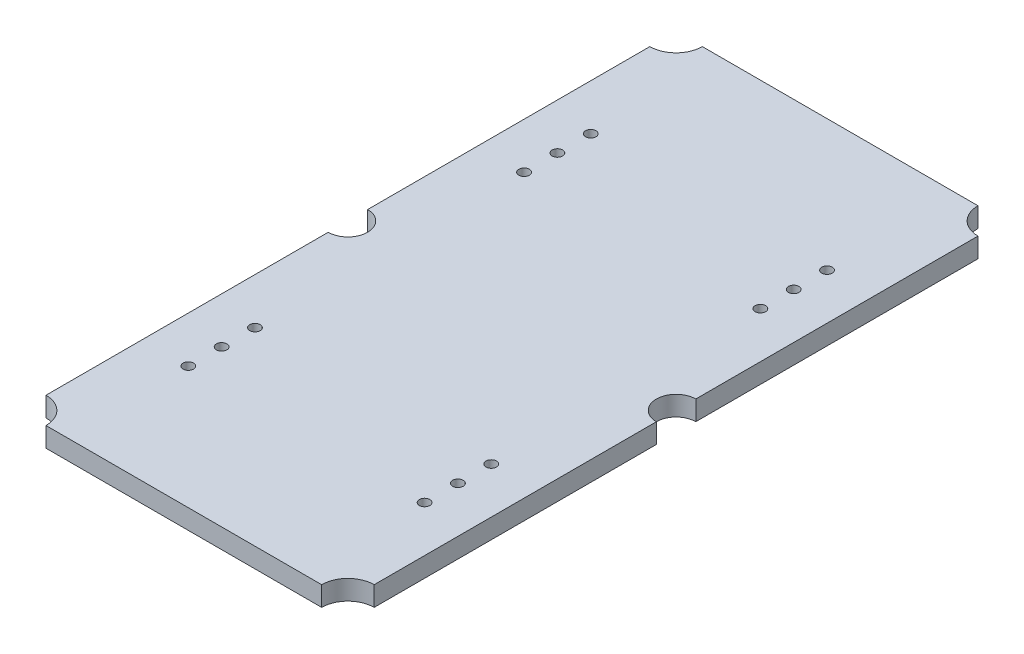
ISO-10303-21;
HEADER;
FILE_DESCRIPTION(('STEP AP214'),'2;1');
FILE_NAME('part.step','',(''),(''),'','','');
FILE_SCHEMA(('AUTOMOTIVE_DESIGN { 1 0 10303 214 1 1 1 1 }'));
ENDSEC;
DATA;
#1=APPLICATION_CONTEXT('core data for automotive mechanical design processes');
#2=APPLICATION_PROTOCOL_DEFINITION('international standard','automotive_design',2000,#1);
#3=PRODUCT_CONTEXT('',#1,'mechanical');
#4=PRODUCT('Part','Part','',(#3));
#5=PRODUCT_RELATED_PRODUCT_CATEGORY('part','',(#4));
#6=PRODUCT_DEFINITION_FORMATION('','',#4);
#7=PRODUCT_DEFINITION_CONTEXT('part definition',#1,'design');
#8=PRODUCT_DEFINITION('design','',#6,#7);
#9=PRODUCT_DEFINITION_SHAPE('','',#8);
#10=(LENGTH_UNIT() NAMED_UNIT(*) SI_UNIT(.MILLI.,.METRE.));
#11=(NAMED_UNIT(*) PLANE_ANGLE_UNIT() SI_UNIT($,.RADIAN.));
#12=(NAMED_UNIT(*) SI_UNIT($,.STERADIAN.) SOLID_ANGLE_UNIT());
#13=UNCERTAINTY_MEASURE_WITH_UNIT(LENGTH_MEASURE(1.E-05),#10,'distance_accuracy_value','');
#14=(GEOMETRIC_REPRESENTATION_CONTEXT(3) GLOBAL_UNCERTAINTY_ASSIGNED_CONTEXT((#13)) GLOBAL_UNIT_ASSIGNED_CONTEXT((#10,
#11,#12)) REPRESENTATION_CONTEXT('',''));
#15=CARTESIAN_POINT('',(0.,0.,0.));
#16=DIRECTION('',(0.,0.,1.));
#17=DIRECTION('',(1.,0.,0.));
#18=AXIS2_PLACEMENT_3D('',#15,#16,#17);
#19=CARTESIAN_POINT('',(0.,1.5,0.));
#20=DIRECTION('',(1.,0.,0.));
#21=DIRECTION('',(0.,0.,-1.));
#22=AXIS2_PLACEMENT_3D('',#19,#20,#21);
#23=PLANE('',#22);
#24=DIRECTION('',(0.,0.,1.));
#25=VECTOR('',#24,1.);
#26=CARTESIAN_POINT('',(0.,1.5,0.));
#27=LINE('',#26,#25);
#28=CARTESIAN_POINT('',(0.,1.5,-48.));
#29=VERTEX_POINT('',#28);
#30=CARTESIAN_POINT('',(0.,1.5,-26.5));
#31=VERTEX_POINT('',#30);
#32=EDGE_CURVE('E141',#29,#31,#27,.T.);
#33=ORIENTED_EDGE('',*,*,#32,.F.);
#34=DIRECTION('',(0.,1.,0.));
#35=VECTOR('',#34,1.);
#36=CARTESIAN_POINT('',(0.,0.,-48.));
#37=LINE('',#36,#35);
#38=CARTESIAN_POINT('',(0.,0.,-48.));
#39=VERTEX_POINT('',#38);
#40=EDGE_CURVE('E223',#29,#39,#37,.F.);
#41=ORIENTED_EDGE('',*,*,#40,.T.);
#42=DIRECTION('',(0.,0.,1.));
#43=VECTOR('',#42,1.);
#44=CARTESIAN_POINT('',(0.,0.,0.));
#45=LINE('',#44,#43);
#46=CARTESIAN_POINT('',(0.,0.,-26.5));
#47=VERTEX_POINT('',#46);
#48=EDGE_CURVE('E159',#39,#47,#45,.T.);
#49=ORIENTED_EDGE('',*,*,#48,.T.);
#50=DIRECTION('',(0.,1.,0.));
#51=VECTOR('',#50,1.);
#52=CARTESIAN_POINT('',(0.,0.,-26.5));
#53=LINE('',#52,#51);
#54=EDGE_CURVE('E196',#47,#31,#53,.T.);
#55=ORIENTED_EDGE('',*,*,#54,.T.);
#56=EDGE_LOOP('',(#33,#41,#49,#55));
#57=FACE_BOUND('',#56,.T.);
#58=ADVANCED_FACE('F35',(#57),#23,.F.);
#59=CARTESIAN_POINT('',(25.,1.5,0.));
#60=DIRECTION('',(-1.,0.,0.));
#61=DIRECTION('',(0.,0.,1.));
#62=AXIS2_PLACEMENT_3D('',#59,#60,#61);
#63=PLANE('',#62);
#64=DIRECTION('',(0.,0.,-1.));
#65=VECTOR('',#64,1.);
#66=CARTESIAN_POINT('',(25.,1.5,0.));
#67=LINE('',#66,#65);
#68=CARTESIAN_POINT('',(25.,1.5,-2.));
#69=VERTEX_POINT('',#68);
#70=CARTESIAN_POINT('',(25.,1.5,-23.5));
#71=VERTEX_POINT('',#70);
#72=EDGE_CURVE('E150',#69,#71,#67,.T.);
#73=ORIENTED_EDGE('',*,*,#72,.F.);
#74=DIRECTION('',(0.,1.,0.));
#75=VECTOR('',#74,1.);
#76=CARTESIAN_POINT('',(25.,0.,-2.));
#77=LINE('',#76,#75);
#78=CARTESIAN_POINT('',(25.,0.,-2.));
#79=VERTEX_POINT('',#78);
#80=EDGE_CURVE('E181',#69,#79,#77,.F.);
#81=ORIENTED_EDGE('',*,*,#80,.T.);
#82=DIRECTION('',(0.,0.,-1.));
#83=VECTOR('',#82,1.);
#84=CARTESIAN_POINT('',(25.,0.,0.));
#85=LINE('',#84,#83);
#86=CARTESIAN_POINT('',(25.,0.,-23.5));
#87=VERTEX_POINT('',#86);
#88=EDGE_CURVE('E138',#79,#87,#85,.T.);
#89=ORIENTED_EDGE('',*,*,#88,.T.);
#90=DIRECTION('',(0.,1.,0.));
#91=VECTOR('',#90,1.);
#92=CARTESIAN_POINT('',(25.,0.,-23.5));
#93=LINE('',#92,#91);
#94=EDGE_CURVE('E180',#87,#71,#93,.T.);
#95=ORIENTED_EDGE('',*,*,#94,.T.);
#96=EDGE_LOOP('',(#73,#81,#89,#95));
#97=FACE_BOUND('',#96,.T.);
#98=ADVANCED_FACE('F179',(#97),#63,.F.);
#99=CARTESIAN_POINT('',(0.,0.,-23.5));
#100=VERTEX_POINT('',#99);
#101=CARTESIAN_POINT('',(0.,0.,-2.));
#102=VERTEX_POINT('',#101);
#103=EDGE_CURVE('E161',#100,#102,#45,.T.);
#104=ORIENTED_EDGE('',*,*,#103,.T.);
#105=DIRECTION('',(0.,1.,0.));
#106=VECTOR('',#105,1.);
#107=CARTESIAN_POINT('',(0.,0.,-2.));
#108=LINE('',#107,#106);
#109=CARTESIAN_POINT('',(0.,1.5,-2.));
#110=VERTEX_POINT('',#109);
#111=EDGE_CURVE('E214',#102,#110,#108,.T.);
#112=ORIENTED_EDGE('',*,*,#111,.T.);
#113=CARTESIAN_POINT('',(0.,1.5,-23.5));
#114=VERTEX_POINT('',#113);
#115=EDGE_CURVE('E137',#114,#110,#27,.T.);
#116=ORIENTED_EDGE('',*,*,#115,.F.);
#117=DIRECTION('',(0.,1.,0.));
#118=VECTOR('',#117,1.);
#119=CARTESIAN_POINT('',(0.,0.,-23.5));
#120=LINE('',#119,#118);
#121=EDGE_CURVE('E198',#114,#100,#120,.F.);
#122=ORIENTED_EDGE('',*,*,#121,.T.);
#123=EDGE_LOOP('',(#104,#112,#116,#122));
#124=FACE_BOUND('',#123,.T.);
#125=ADVANCED_FACE('F37',(#124),#23,.F.);
#126=CARTESIAN_POINT('',(0.,1.5,0.));
#127=DIRECTION('',(0.,0.,-1.));
#128=DIRECTION('',(-1.,0.,0.));
#129=AXIS2_PLACEMENT_3D('',#126,#127,#128);
#130=PLANE('',#129);
#131=DIRECTION('',(1.,0.,0.));
#132=VECTOR('',#131,1.);
#133=CARTESIAN_POINT('',(0.,1.5,0.));
#134=LINE('',#133,#132);
#135=CARTESIAN_POINT('',(2.,1.5,0.));
#136=VERTEX_POINT('',#135);
#137=CARTESIAN_POINT('',(23.,1.5,0.));
#138=VERTEX_POINT('',#137);
#139=EDGE_CURVE('E190',#136,#138,#134,.T.);
#140=ORIENTED_EDGE('',*,*,#139,.F.);
#141=DIRECTION('',(0.,1.,0.));
#142=VECTOR('',#141,1.);
#143=CARTESIAN_POINT('',(2.,0.,0.));
#144=LINE('',#143,#142);
#145=CARTESIAN_POINT('',(2.,0.,0.));
#146=VERTEX_POINT('',#145);
#147=EDGE_CURVE('E218',#136,#146,#144,.F.);
#148=ORIENTED_EDGE('',*,*,#147,.T.);
#149=DIRECTION('',(1.,0.,0.));
#150=VECTOR('',#149,1.);
#151=CARTESIAN_POINT('',(0.,0.,0.));
#152=LINE('',#151,#150);
#153=CARTESIAN_POINT('',(23.,0.,0.));
#154=VERTEX_POINT('',#153);
#155=EDGE_CURVE('E160',#146,#154,#152,.T.);
#156=ORIENTED_EDGE('',*,*,#155,.T.);
#157=DIRECTION('',(0.,1.,0.));
#158=VECTOR('',#157,1.);
#159=CARTESIAN_POINT('',(23.,0.,0.));
#160=LINE('',#159,#158);
#161=EDGE_CURVE('E210',#154,#138,#160,.T.);
#162=ORIENTED_EDGE('',*,*,#161,.T.);
#163=EDGE_LOOP('',(#140,#148,#156,#162));
#164=FACE_BOUND('',#163,.T.);
#165=ADVANCED_FACE('F365',(#164),#130,.F.);
#166=CARTESIAN_POINT('',(25.,0.,-26.5));
#167=VERTEX_POINT('',#166);
#168=CARTESIAN_POINT('',(25.,0.,-48.));
#169=VERTEX_POINT('',#168);
#170=EDGE_CURVE('E143',#167,#169,#85,.T.);
#171=ORIENTED_EDGE('',*,*,#170,.T.);
#172=DIRECTION('',(0.,1.,0.));
#173=VECTOR('',#172,1.);
#174=CARTESIAN_POINT('',(25.,0.,-48.));
#175=LINE('',#174,#173);
#176=CARTESIAN_POINT('',(25.,1.5,-48.));
#177=VERTEX_POINT('',#176);
#178=EDGE_CURVE('E49',#169,#177,#175,.T.);
#179=ORIENTED_EDGE('',*,*,#178,.T.);
#180=CARTESIAN_POINT('',(25.,1.5,-26.5));
#181=VERTEX_POINT('',#180);
#182=EDGE_CURVE('E155',#181,#177,#67,.T.);
#183=ORIENTED_EDGE('',*,*,#182,.F.);
#184=DIRECTION('',(0.,1.,0.));
#185=VECTOR('',#184,1.);
#186=CARTESIAN_POINT('',(25.,0.,-26.5));
#187=LINE('',#186,#185);
#188=EDGE_CURVE('E171',#181,#167,#187,.F.);
#189=ORIENTED_EDGE('',*,*,#188,.T.);
#190=EDGE_LOOP('',(#171,#179,#183,#189));
#191=FACE_BOUND('',#190,.T.);
#192=ADVANCED_FACE('F168',(#191),#63,.F.);
#193=CARTESIAN_POINT('',(0.,1.5,-50.));
#194=DIRECTION('',(0.,0.,1.));
#195=DIRECTION('',(1.,0.,0.));
#196=AXIS2_PLACEMENT_3D('',#193,#194,#195);
#197=PLANE('',#196);
#198=DIRECTION('',(-1.,0.,0.));
#199=VECTOR('',#198,1.);
#200=CARTESIAN_POINT('',(0.,1.5,-50.));
#201=LINE('',#200,#199);
#202=CARTESIAN_POINT('',(23.,1.5,-50.));
#203=VERTEX_POINT('',#202);
#204=CARTESIAN_POINT('',(2.,1.5,-50.));
#205=VERTEX_POINT('',#204);
#206=EDGE_CURVE('E130',#203,#205,#201,.T.);
#207=ORIENTED_EDGE('',*,*,#206,.F.);
#208=DIRECTION('',(0.,1.,0.));
#209=VECTOR('',#208,1.);
#210=CARTESIAN_POINT('',(23.,0.,-50.));
#211=LINE('',#210,#209);
#212=CARTESIAN_POINT('',(23.,0.,-50.));
#213=VERTEX_POINT('',#212);
#214=EDGE_CURVE('E123',#203,#213,#211,.F.);
#215=ORIENTED_EDGE('',*,*,#214,.T.);
#216=DIRECTION('',(-1.,0.,0.));
#217=VECTOR('',#216,1.);
#218=CARTESIAN_POINT('',(0.,0.,-50.));
#219=LINE('',#218,#217);
#220=CARTESIAN_POINT('',(2.,0.,-50.));
#221=VERTEX_POINT('',#220);
#222=EDGE_CURVE('E57',#213,#221,#219,.T.);
#223=ORIENTED_EDGE('',*,*,#222,.T.);
#224=DIRECTION('',(0.,1.,0.));
#225=VECTOR('',#224,1.);
#226=CARTESIAN_POINT('',(2.,0.,-50.));
#227=LINE('',#226,#225);
#228=EDGE_CURVE('E228',#221,#205,#227,.T.);
#229=ORIENTED_EDGE('',*,*,#228,.T.);
#230=EDGE_LOOP('',(#207,#215,#223,#229));
#231=FACE_BOUND('',#230,.T.);
#232=ADVANCED_FACE('F129',(#231),#197,.F.);
#233=CARTESIAN_POINT('',(0.,1.5,0.));
#234=DIRECTION('',(0.,-1.,0.));
#235=DIRECTION('',(0.,0.,-1.));
#236=AXIS2_PLACEMENT_3D('',#233,#234,#235);
#237=PLANE('',#236);
#238=CARTESIAN_POINT('',(21.5,1.5,-34.92));
#239=DIRECTION('',(0.,1.,0.));
#240=DIRECTION('',(0.,0.,1.));
#241=AXIS2_PLACEMENT_3D('',#238,#239,#240);
#242=CIRCLE('',#241,0.399999999999997);
#243=CARTESIAN_POINT('',(21.5,1.5,-34.52));
#244=VERTEX_POINT('',#243);
#245=EDGE_CURVE('E302',#244,#244,#242,.T.);
#246=ORIENTED_EDGE('',*,*,#245,.F.);
#247=EDGE_LOOP('',(#246));
#248=FACE_BOUND('',#247,.T.);
#249=CARTESIAN_POINT('',(3.50000000000005,1.5,-34.92));
#250=DIRECTION('',(0.,1.,0.));
#251=DIRECTION('',(0.,0.,1.));
#252=AXIS2_PLACEMENT_3D('',#249,#250,#251);
#253=CIRCLE('',#252,0.399999999999998);
#254=CARTESIAN_POINT('',(3.50000000000005,1.5,-34.52));
#255=VERTEX_POINT('',#254);
#256=EDGE_CURVE('E296',#255,#255,#253,.T.);
#257=ORIENTED_EDGE('',*,*,#256,.F.);
#258=EDGE_LOOP('',(#257));
#259=FACE_BOUND('',#258,.T.);
#260=CARTESIAN_POINT('',(21.5000000000003,1.5,-9.34));
#261=DIRECTION('',(0.,1.,0.));
#262=DIRECTION('',(0.,0.,1.));
#263=AXIS2_PLACEMENT_3D('',#260,#261,#262);
#264=CIRCLE('',#263,0.399999999999998);
#265=CARTESIAN_POINT('',(21.5000000000003,1.5,-8.94));
#266=VERTEX_POINT('',#265);
#267=EDGE_CURVE('E290',#266,#266,#264,.T.);
#268=ORIENTED_EDGE('',*,*,#267,.F.);
#269=EDGE_LOOP('',(#268));
#270=FACE_BOUND('',#269,.T.);
#271=CARTESIAN_POINT('',(21.5000000000003,1.5,-11.88));
#272=DIRECTION('',(0.,1.,0.));
#273=DIRECTION('',(0.,0.,1.));
#274=AXIS2_PLACEMENT_3D('',#271,#272,#273);
#275=CIRCLE('',#274,0.399999999999998);
#276=CARTESIAN_POINT('',(21.5000000000003,1.5,-11.48));
#277=VERTEX_POINT('',#276);
#278=EDGE_CURVE('E284',#277,#277,#275,.T.);
#279=ORIENTED_EDGE('',*,*,#278,.F.);
#280=EDGE_LOOP('',(#279));
#281=FACE_BOUND('',#280,.T.);
#282=CARTESIAN_POINT('',(21.5000000000003,1.5,-14.42));
#283=DIRECTION('',(0.,1.,0.));
#284=DIRECTION('',(0.,0.,1.));
#285=AXIS2_PLACEMENT_3D('',#282,#283,#284);
#286=CIRCLE('',#285,0.399999999999998);
#287=CARTESIAN_POINT('',(21.5000000000003,1.5,-14.02));
#288=VERTEX_POINT('',#287);
#289=EDGE_CURVE('E278',#288,#288,#286,.T.);
#290=ORIENTED_EDGE('',*,*,#289,.F.);
#291=EDGE_LOOP('',(#290));
#292=FACE_BOUND('',#291,.T.);
#293=CARTESIAN_POINT('',(21.5,1.5,-37.46));
#294=DIRECTION('',(0.,1.,0.));
#295=DIRECTION('',(0.,0.,1.));
#296=AXIS2_PLACEMENT_3D('',#293,#294,#295);
#297=CIRCLE('',#296,0.399999999999997);
#298=CARTESIAN_POINT('',(21.5,1.5,-37.06));
#299=VERTEX_POINT('',#298);
#300=EDGE_CURVE('E272',#299,#299,#297,.T.);
#301=ORIENTED_EDGE('',*,*,#300,.F.);
#302=EDGE_LOOP('',(#301));
#303=FACE_BOUND('',#302,.T.);
#304=CARTESIAN_POINT('',(3.50000000000032,1.5,-9.34));
#305=DIRECTION('',(0.,1.,0.));
#306=DIRECTION('',(0.,0.,1.));
#307=AXIS2_PLACEMENT_3D('',#304,#305,#306);
#308=CIRCLE('',#307,0.399999999999998);
#309=CARTESIAN_POINT('',(3.50000000000032,1.5,-8.94));
#310=VERTEX_POINT('',#309);
#311=EDGE_CURVE('E266',#310,#310,#308,.T.);
#312=ORIENTED_EDGE('',*,*,#311,.F.);
#313=EDGE_LOOP('',(#312));
#314=FACE_BOUND('',#313,.T.);
#315=CARTESIAN_POINT('',(21.5,1.5,-40.));
#316=DIRECTION('',(0.,1.,0.));
#317=DIRECTION('',(0.,0.,1.));
#318=AXIS2_PLACEMENT_3D('',#315,#316,#317);
#319=CIRCLE('',#318,0.399999999999997);
#320=CARTESIAN_POINT('',(21.5,1.5,-39.6));
#321=VERTEX_POINT('',#320);
#322=EDGE_CURVE('E260',#321,#321,#319,.T.);
#323=ORIENTED_EDGE('',*,*,#322,.F.);
#324=EDGE_LOOP('',(#323));
#325=FACE_BOUND('',#324,.T.);
#326=CARTESIAN_POINT('',(3.50000000000029,1.5,-11.88));
#327=DIRECTION('',(0.,1.,0.));
#328=DIRECTION('',(0.,0.,1.));
#329=AXIS2_PLACEMENT_3D('',#326,#327,#328);
#330=CIRCLE('',#329,0.399999999999998);
#331=CARTESIAN_POINT('',(3.50000000000029,1.5,-11.48));
#332=VERTEX_POINT('',#331);
#333=EDGE_CURVE('E254',#332,#332,#330,.T.);
#334=ORIENTED_EDGE('',*,*,#333,.F.);
#335=EDGE_LOOP('',(#334));
#336=FACE_BOUND('',#335,.T.);
#337=CARTESIAN_POINT('',(3.50000000000027,1.5,-14.42));
#338=DIRECTION('',(0.,1.,0.));
#339=DIRECTION('',(0.,0.,1.));
#340=AXIS2_PLACEMENT_3D('',#337,#338,#339);
#341=CIRCLE('',#340,0.399999999999999);
#342=CARTESIAN_POINT('',(3.50000000000027,1.5,-14.02));
#343=VERTEX_POINT('',#342);
#344=EDGE_CURVE('E248',#343,#343,#341,.T.);
#345=ORIENTED_EDGE('',*,*,#344,.F.);
#346=EDGE_LOOP('',(#345));
#347=FACE_BOUND('',#346,.T.);
#348=CARTESIAN_POINT('',(3.50000000000003,1.5,-37.46));
#349=DIRECTION('',(0.,1.,0.));
#350=DIRECTION('',(0.,0.,1.));
#351=AXIS2_PLACEMENT_3D('',#348,#349,#350);
#352=CIRCLE('',#351,0.399999999999998);
#353=CARTESIAN_POINT('',(3.50000000000003,1.5,-37.06));
#354=VERTEX_POINT('',#353);
#355=EDGE_CURVE('E242',#354,#354,#352,.T.);
#356=ORIENTED_EDGE('',*,*,#355,.F.);
#357=EDGE_LOOP('',(#356));
#358=FACE_BOUND('',#357,.T.);
#359=CARTESIAN_POINT('',(3.5,1.5,-40.));
#360=DIRECTION('',(0.,1.,0.));
#361=DIRECTION('',(0.,0.,1.));
#362=AXIS2_PLACEMENT_3D('',#359,#360,#361);
#363=CIRCLE('',#362,0.399999999999997);
#364=CARTESIAN_POINT('',(3.5,1.5,-39.6));
#365=VERTEX_POINT('',#364);
#366=EDGE_CURVE('E236',#365,#365,#363,.T.);
#367=ORIENTED_EDGE('',*,*,#366,.F.);
#368=EDGE_LOOP('',(#367));
#369=FACE_BOUND('',#368,.T.);
#370=ORIENTED_EDGE('',*,*,#182,.T.);
#371=CARTESIAN_POINT('',(25.,1.5,-50.));
#372=DIRECTION('',(0.,1.,0.));
#373=DIRECTION('',(0.,0.,1.));
#374=AXIS2_PLACEMENT_3D('',#371,#372,#373);
#375=CIRCLE('',#374,2.);
#376=EDGE_CURVE('E131',#203,#177,#375,.T.);
#377=ORIENTED_EDGE('',*,*,#376,.F.);
#378=ORIENTED_EDGE('',*,*,#206,.T.);
#379=CARTESIAN_POINT('',(0.,1.5,-50.));
#380=DIRECTION('',(0.,1.,0.));
#381=DIRECTION('',(0.,0.,1.));
#382=AXIS2_PLACEMENT_3D('',#379,#380,#381);
#383=CIRCLE('',#382,2.);
#384=EDGE_CURVE('E230',#29,#205,#383,.T.);
#385=ORIENTED_EDGE('',*,*,#384,.F.);
#386=ORIENTED_EDGE('',*,*,#32,.T.);
#387=CARTESIAN_POINT('',(0.,1.5,-25.));
#388=DIRECTION('',(0.,1.,0.));
#389=DIRECTION('',(0.,0.,1.));
#390=AXIS2_PLACEMENT_3D('',#387,#388,#389);
#391=CIRCLE('',#390,1.5);
#392=EDGE_CURVE('E204',#114,#31,#391,.T.);
#393=ORIENTED_EDGE('',*,*,#392,.F.);
#394=ORIENTED_EDGE('',*,*,#115,.T.);
#395=CARTESIAN_POINT('',(0.,1.5,0.));
#396=DIRECTION('',(0.,1.,0.));
#397=DIRECTION('',(0.,0.,1.));
#398=AXIS2_PLACEMENT_3D('',#395,#396,#397);
#399=CIRCLE('',#398,2.);
#400=EDGE_CURVE('E221',#136,#110,#399,.T.);
#401=ORIENTED_EDGE('',*,*,#400,.F.);
#402=ORIENTED_EDGE('',*,*,#139,.T.);
#403=CARTESIAN_POINT('',(25.,1.5,0.));
#404=DIRECTION('',(0.,1.,0.));
#405=DIRECTION('',(0.,0.,1.));
#406=AXIS2_PLACEMENT_3D('',#403,#404,#405);
#407=CIRCLE('',#406,2.);
#408=EDGE_CURVE('E212',#69,#138,#407,.T.);
#409=ORIENTED_EDGE('',*,*,#408,.F.);
#410=ORIENTED_EDGE('',*,*,#72,.T.);
#411=CARTESIAN_POINT('',(25.,1.5,-25.));
#412=DIRECTION('',(0.,1.,0.));
#413=DIRECTION('',(0.,0.,1.));
#414=AXIS2_PLACEMENT_3D('',#411,#412,#413);
#415=CIRCLE('',#414,1.5);
#416=EDGE_CURVE('E185',#181,#71,#415,.T.);
#417=ORIENTED_EDGE('',*,*,#416,.F.);
#418=EDGE_LOOP('',(#370,#377,#378,#385,#386,#393,#394,#401,#402,#409,#410,#417));
#419=FACE_BOUND('',#418,.T.);
#420=ADVANCED_FACE('F195',(#248,#259,#270,#281,#292,#303,#314,#325,#336,#347,#358,#369,#419),
#237,.F.);
#421=CARTESIAN_POINT('',(0.,0.,0.));
#422=DIRECTION('',(0.,-1.,0.));
#423=DIRECTION('',(0.,0.,-1.));
#424=AXIS2_PLACEMENT_3D('',#421,#422,#423);
#425=PLANE('',#424);
#426=CARTESIAN_POINT('',(21.5,0.,-34.92));
#427=DIRECTION('',(0.,1.,0.));
#428=DIRECTION('',(0.,0.,1.));
#429=AXIS2_PLACEMENT_3D('',#426,#427,#428);
#430=CIRCLE('',#429,0.399999999999997);
#431=CARTESIAN_POINT('',(21.5,0.,-34.52));
#432=VERTEX_POINT('',#431);
#433=EDGE_CURVE('E299',#432,#432,#430,.T.);
#434=ORIENTED_EDGE('',*,*,#433,.T.);
#435=EDGE_LOOP('',(#434));
#436=FACE_BOUND('',#435,.T.);
#437=CARTESIAN_POINT('',(3.50000000000005,0.,-34.92));
#438=DIRECTION('',(0.,1.,0.));
#439=DIRECTION('',(0.,0.,1.));
#440=AXIS2_PLACEMENT_3D('',#437,#438,#439);
#441=CIRCLE('',#440,0.399999999999998);
#442=CARTESIAN_POINT('',(3.50000000000005,0.,-34.52));
#443=VERTEX_POINT('',#442);
#444=EDGE_CURVE('E293',#443,#443,#441,.T.);
#445=ORIENTED_EDGE('',*,*,#444,.T.);
#446=EDGE_LOOP('',(#445));
#447=FACE_BOUND('',#446,.T.);
#448=CARTESIAN_POINT('',(21.5000000000003,0.,-9.34));
#449=DIRECTION('',(0.,1.,0.));
#450=DIRECTION('',(0.,0.,1.));
#451=AXIS2_PLACEMENT_3D('',#448,#449,#450);
#452=CIRCLE('',#451,0.399999999999998);
#453=CARTESIAN_POINT('',(21.5000000000003,0.,-8.94));
#454=VERTEX_POINT('',#453);
#455=EDGE_CURVE('E287',#454,#454,#452,.T.);
#456=ORIENTED_EDGE('',*,*,#455,.T.);
#457=EDGE_LOOP('',(#456));
#458=FACE_BOUND('',#457,.T.);
#459=CARTESIAN_POINT('',(21.5000000000003,0.,-11.88));
#460=DIRECTION('',(0.,1.,0.));
#461=DIRECTION('',(0.,0.,1.));
#462=AXIS2_PLACEMENT_3D('',#459,#460,#461);
#463=CIRCLE('',#462,0.399999999999998);
#464=CARTESIAN_POINT('',(21.5000000000003,0.,-11.48));
#465=VERTEX_POINT('',#464);
#466=EDGE_CURVE('E281',#465,#465,#463,.T.);
#467=ORIENTED_EDGE('',*,*,#466,.T.);
#468=EDGE_LOOP('',(#467));
#469=FACE_BOUND('',#468,.T.);
#470=CARTESIAN_POINT('',(21.5000000000003,0.,-14.42));
#471=DIRECTION('',(0.,1.,0.));
#472=DIRECTION('',(0.,0.,1.));
#473=AXIS2_PLACEMENT_3D('',#470,#471,#472);
#474=CIRCLE('',#473,0.399999999999998);
#475=CARTESIAN_POINT('',(21.5000000000003,0.,-14.02));
#476=VERTEX_POINT('',#475);
#477=EDGE_CURVE('E275',#476,#476,#474,.T.);
#478=ORIENTED_EDGE('',*,*,#477,.T.);
#479=EDGE_LOOP('',(#478));
#480=FACE_BOUND('',#479,.T.);
#481=CARTESIAN_POINT('',(21.5,0.,-37.46));
#482=DIRECTION('',(0.,1.,0.));
#483=DIRECTION('',(0.,0.,1.));
#484=AXIS2_PLACEMENT_3D('',#481,#482,#483);
#485=CIRCLE('',#484,0.399999999999997);
#486=CARTESIAN_POINT('',(21.5,0.,-37.06));
#487=VERTEX_POINT('',#486);
#488=EDGE_CURVE('E269',#487,#487,#485,.T.);
#489=ORIENTED_EDGE('',*,*,#488,.T.);
#490=EDGE_LOOP('',(#489));
#491=FACE_BOUND('',#490,.T.);
#492=CARTESIAN_POINT('',(3.50000000000032,0.,-9.34));
#493=DIRECTION('',(0.,1.,0.));
#494=DIRECTION('',(0.,0.,1.));
#495=AXIS2_PLACEMENT_3D('',#492,#493,#494);
#496=CIRCLE('',#495,0.399999999999998);
#497=CARTESIAN_POINT('',(3.50000000000032,0.,-8.94));
#498=VERTEX_POINT('',#497);
#499=EDGE_CURVE('E263',#498,#498,#496,.T.);
#500=ORIENTED_EDGE('',*,*,#499,.T.);
#501=EDGE_LOOP('',(#500));
#502=FACE_BOUND('',#501,.T.);
#503=CARTESIAN_POINT('',(21.5,0.,-40.));
#504=DIRECTION('',(0.,1.,0.));
#505=DIRECTION('',(0.,0.,1.));
#506=AXIS2_PLACEMENT_3D('',#503,#504,#505);
#507=CIRCLE('',#506,0.399999999999997);
#508=CARTESIAN_POINT('',(21.5,0.,-39.6));
#509=VERTEX_POINT('',#508);
#510=EDGE_CURVE('E257',#509,#509,#507,.T.);
#511=ORIENTED_EDGE('',*,*,#510,.T.);
#512=EDGE_LOOP('',(#511));
#513=FACE_BOUND('',#512,.T.);
#514=CARTESIAN_POINT('',(3.50000000000029,0.,-11.88));
#515=DIRECTION('',(0.,1.,0.));
#516=DIRECTION('',(0.,0.,1.));
#517=AXIS2_PLACEMENT_3D('',#514,#515,#516);
#518=CIRCLE('',#517,0.399999999999998);
#519=CARTESIAN_POINT('',(3.50000000000029,0.,-11.48));
#520=VERTEX_POINT('',#519);
#521=EDGE_CURVE('E251',#520,#520,#518,.T.);
#522=ORIENTED_EDGE('',*,*,#521,.T.);
#523=EDGE_LOOP('',(#522));
#524=FACE_BOUND('',#523,.T.);
#525=CARTESIAN_POINT('',(3.50000000000027,0.,-14.42));
#526=DIRECTION('',(0.,1.,0.));
#527=DIRECTION('',(0.,0.,1.));
#528=AXIS2_PLACEMENT_3D('',#525,#526,#527);
#529=CIRCLE('',#528,0.399999999999999);
#530=CARTESIAN_POINT('',(3.50000000000027,0.,-14.02));
#531=VERTEX_POINT('',#530);
#532=EDGE_CURVE('E245',#531,#531,#529,.T.);
#533=ORIENTED_EDGE('',*,*,#532,.T.);
#534=EDGE_LOOP('',(#533));
#535=FACE_BOUND('',#534,.T.);
#536=CARTESIAN_POINT('',(3.50000000000003,0.,-37.46));
#537=DIRECTION('',(0.,1.,0.));
#538=DIRECTION('',(0.,0.,1.));
#539=AXIS2_PLACEMENT_3D('',#536,#537,#538);
#540=CIRCLE('',#539,0.399999999999998);
#541=CARTESIAN_POINT('',(3.50000000000003,0.,-37.06));
#542=VERTEX_POINT('',#541);
#543=EDGE_CURVE('E239',#542,#542,#540,.T.);
#544=ORIENTED_EDGE('',*,*,#543,.T.);
#545=EDGE_LOOP('',(#544));
#546=FACE_BOUND('',#545,.T.);
#547=CARTESIAN_POINT('',(3.5,0.,-40.));
#548=DIRECTION('',(0.,1.,0.));
#549=DIRECTION('',(0.,0.,1.));
#550=AXIS2_PLACEMENT_3D('',#547,#548,#549);
#551=CIRCLE('',#550,0.399999999999997);
#552=CARTESIAN_POINT('',(3.5,0.,-39.6));
#553=VERTEX_POINT('',#552);
#554=EDGE_CURVE('E235',#553,#553,#551,.T.);
#555=ORIENTED_EDGE('',*,*,#554,.T.);
#556=EDGE_LOOP('',(#555));
#557=FACE_BOUND('',#556,.T.);
#558=CARTESIAN_POINT('',(25.,0.,-50.));
#559=DIRECTION('',(0.,-1.,0.));
#560=DIRECTION('',(0.,0.,-1.));
#561=AXIS2_PLACEMENT_3D('',#558,#559,#560);
#562=CIRCLE('',#561,2.);
#563=EDGE_CURVE('E11',#169,#213,#562,.T.);
#564=ORIENTED_EDGE('',*,*,#563,.F.);
#565=ORIENTED_EDGE('',*,*,#170,.F.);
#566=CARTESIAN_POINT('',(25.,0.,-25.));
#567=DIRECTION('',(0.,-1.,0.));
#568=DIRECTION('',(0.,0.,-1.));
#569=AXIS2_PLACEMENT_3D('',#566,#567,#568);
#570=CIRCLE('',#569,1.5);
#571=EDGE_CURVE('E43',#87,#167,#570,.T.);
#572=ORIENTED_EDGE('',*,*,#571,.F.);
#573=ORIENTED_EDGE('',*,*,#88,.F.);
#574=CARTESIAN_POINT('',(25.,0.,0.));
#575=DIRECTION('',(0.,1.,0.));
#576=DIRECTION('',(0.,0.,1.));
#577=AXIS2_PLACEMENT_3D('',#574,#575,#576);
#578=CIRCLE('',#577,2.);
#579=EDGE_CURVE('E174',#79,#154,#578,.T.);
#580=ORIENTED_EDGE('',*,*,#579,.T.);
#581=ORIENTED_EDGE('',*,*,#155,.F.);
#582=CARTESIAN_POINT('',(0.,0.,0.));
#583=DIRECTION('',(0.,1.,0.));
#584=DIRECTION('',(0.,0.,1.));
#585=AXIS2_PLACEMENT_3D('',#582,#583,#584);
#586=CIRCLE('',#585,2.);
#587=EDGE_CURVE('E220',#146,#102,#586,.T.);
#588=ORIENTED_EDGE('',*,*,#587,.T.);
#589=ORIENTED_EDGE('',*,*,#103,.F.);
#590=CARTESIAN_POINT('',(0.,0.,-25.));
#591=DIRECTION('',(0.,1.,0.));
#592=DIRECTION('',(0.,0.,1.));
#593=AXIS2_PLACEMENT_3D('',#590,#591,#592);
#594=CIRCLE('',#593,1.5);
#595=EDGE_CURVE('E203',#100,#47,#594,.T.);
#596=ORIENTED_EDGE('',*,*,#595,.T.);
#597=ORIENTED_EDGE('',*,*,#48,.F.);
#598=CARTESIAN_POINT('',(0.,0.,-50.));
#599=DIRECTION('',(0.,1.,0.));
#600=DIRECTION('',(0.,0.,1.));
#601=AXIS2_PLACEMENT_3D('',#598,#599,#600);
#602=CIRCLE('',#601,2.);
#603=EDGE_CURVE('E136',#39,#221,#602,.T.);
#604=ORIENTED_EDGE('',*,*,#603,.T.);
#605=ORIENTED_EDGE('',*,*,#222,.F.);
#606=EDGE_LOOP('',(#564,#565,#572,#573,#580,#581,#588,#589,#596,#597,#604,#605));
#607=FACE_BOUND('',#606,.T.);
#608=ADVANCED_FACE('F134',(#436,#447,#458,#469,#480,#491,#502,#513,#524,#535,#546,#557,#607),
#425,.T.);
#609=CARTESIAN_POINT('',(25.,0.,-25.));
#610=DIRECTION('',(0.,1.,0.));
#611=DIRECTION('',(0.,0.,1.));
#612=AXIS2_PLACEMENT_3D('',#609,#610,#611);
#613=CYLINDRICAL_SURFACE('',#612,1.5);
#614=ORIENTED_EDGE('',*,*,#571,.T.);
#615=ORIENTED_EDGE('',*,*,#188,.F.);
#616=ORIENTED_EDGE('',*,*,#416,.T.);
#617=ORIENTED_EDGE('',*,*,#94,.F.);
#618=EDGE_LOOP('',(#614,#615,#616,#617));
#619=FACE_BOUND('',#618,.T.);
#620=ADVANCED_FACE('F183',(#619),#613,.F.);
#621=CARTESIAN_POINT('',(0.,0.,-25.));
#622=DIRECTION('',(0.,1.,0.));
#623=DIRECTION('',(0.,0.,1.));
#624=AXIS2_PLACEMENT_3D('',#621,#622,#623);
#625=CYLINDRICAL_SURFACE('',#624,1.5);
#626=ORIENTED_EDGE('',*,*,#595,.F.);
#627=ORIENTED_EDGE('',*,*,#121,.F.);
#628=ORIENTED_EDGE('',*,*,#392,.T.);
#629=ORIENTED_EDGE('',*,*,#54,.F.);
#630=EDGE_LOOP('',(#626,#627,#628,#629));
#631=FACE_BOUND('',#630,.T.);
#632=ADVANCED_FACE('F377',(#631),#625,.F.);
#633=CARTESIAN_POINT('',(25.,0.,0.));
#634=DIRECTION('',(0.,1.,0.));
#635=DIRECTION('',(0.,0.,1.));
#636=AXIS2_PLACEMENT_3D('',#633,#634,#635);
#637=CYLINDRICAL_SURFACE('',#636,2.);
#638=ORIENTED_EDGE('',*,*,#408,.T.);
#639=ORIENTED_EDGE('',*,*,#161,.F.);
#640=ORIENTED_EDGE('',*,*,#579,.F.);
#641=ORIENTED_EDGE('',*,*,#80,.F.);
#642=EDGE_LOOP('',(#638,#639,#640,#641));
#643=FACE_BOUND('',#642,.T.);
#644=ADVANCED_FACE('F375',(#643),#637,.F.);
#645=CARTESIAN_POINT('',(0.,0.,0.));
#646=DIRECTION('',(0.,1.,0.));
#647=DIRECTION('',(0.,0.,1.));
#648=AXIS2_PLACEMENT_3D('',#645,#646,#647);
#649=CYLINDRICAL_SURFACE('',#648,2.);
#650=ORIENTED_EDGE('',*,*,#587,.F.);
#651=ORIENTED_EDGE('',*,*,#147,.F.);
#652=ORIENTED_EDGE('',*,*,#400,.T.);
#653=ORIENTED_EDGE('',*,*,#111,.F.);
#654=EDGE_LOOP('',(#650,#651,#652,#653));
#655=FACE_BOUND('',#654,.T.);
#656=ADVANCED_FACE('F373',(#655),#649,.F.);
#657=CARTESIAN_POINT('',(0.,0.,-50.));
#658=DIRECTION('',(0.,1.,0.));
#659=DIRECTION('',(0.,0.,1.));
#660=AXIS2_PLACEMENT_3D('',#657,#658,#659);
#661=CYLINDRICAL_SURFACE('',#660,2.);
#662=ORIENTED_EDGE('',*,*,#384,.T.);
#663=ORIENTED_EDGE('',*,*,#228,.F.);
#664=ORIENTED_EDGE('',*,*,#603,.F.);
#665=ORIENTED_EDGE('',*,*,#40,.F.);
#666=EDGE_LOOP('',(#662,#663,#664,#665));
#667=FACE_BOUND('',#666,.T.);
#668=ADVANCED_FACE('F354',(#667),#661,.F.);
#669=CARTESIAN_POINT('',(25.,0.,-50.));
#670=DIRECTION('',(0.,1.,0.));
#671=DIRECTION('',(0.,0.,1.));
#672=AXIS2_PLACEMENT_3D('',#669,#670,#671);
#673=CYLINDRICAL_SURFACE('',#672,2.);
#674=ORIENTED_EDGE('',*,*,#563,.T.);
#675=ORIENTED_EDGE('',*,*,#214,.F.);
#676=ORIENTED_EDGE('',*,*,#376,.T.);
#677=ORIENTED_EDGE('',*,*,#178,.F.);
#678=EDGE_LOOP('',(#674,#675,#676,#677));
#679=FACE_BOUND('',#678,.T.);
#680=ADVANCED_FACE('F122',(#679),#673,.F.);
#681=CARTESIAN_POINT('',(3.5,0.,-40.));
#682=DIRECTION('',(0.,1.,0.));
#683=DIRECTION('',(0.,0.,1.));
#684=AXIS2_PLACEMENT_3D('',#681,#682,#683);
#685=CYLINDRICAL_SURFACE('',#684,0.399999999999997);
#686=ORIENTED_EDGE('',*,*,#554,.F.);
#687=EDGE_LOOP('',(#686));
#688=FACE_BOUND('',#687,.T.);
#689=ORIENTED_EDGE('',*,*,#366,.T.);
#690=EDGE_LOOP('',(#689));
#691=FACE_BOUND('',#690,.T.);
#692=ADVANCED_FACE('F342',(#688,#691),#685,.F.);
#693=CARTESIAN_POINT('',(3.50000000000003,0.,-37.46));
#694=DIRECTION('',(0.,1.,0.));
#695=DIRECTION('',(0.,0.,1.));
#696=AXIS2_PLACEMENT_3D('',#693,#694,#695);
#697=CYLINDRICAL_SURFACE('',#696,0.399999999999998);
#698=ORIENTED_EDGE('',*,*,#543,.F.);
#699=EDGE_LOOP('',(#698));
#700=FACE_BOUND('',#699,.T.);
#701=ORIENTED_EDGE('',*,*,#355,.T.);
#702=EDGE_LOOP('',(#701));
#703=FACE_BOUND('',#702,.T.);
#704=ADVANCED_FACE('F344',(#700,#703),#697,.F.);
#705=CARTESIAN_POINT('',(3.50000000000027,0.,-14.42));
#706=DIRECTION('',(0.,1.,0.));
#707=DIRECTION('',(0.,0.,1.));
#708=AXIS2_PLACEMENT_3D('',#705,#706,#707);
#709=CYLINDRICAL_SURFACE('',#708,0.399999999999999);
#710=ORIENTED_EDGE('',*,*,#532,.F.);
#711=EDGE_LOOP('',(#710));
#712=FACE_BOUND('',#711,.T.);
#713=ORIENTED_EDGE('',*,*,#344,.T.);
#714=EDGE_LOOP('',(#713));
#715=FACE_BOUND('',#714,.T.);
#716=ADVANCED_FACE('F351',(#712,#715),#709,.F.);
#717=CARTESIAN_POINT('',(3.50000000000029,0.,-11.88));
#718=DIRECTION('',(0.,1.,0.));
#719=DIRECTION('',(0.,0.,1.));
#720=AXIS2_PLACEMENT_3D('',#717,#718,#719);
#721=CYLINDRICAL_SURFACE('',#720,0.399999999999998);
#722=ORIENTED_EDGE('',*,*,#521,.F.);
#723=EDGE_LOOP('',(#722));
#724=FACE_BOUND('',#723,.T.);
#725=ORIENTED_EDGE('',*,*,#333,.T.);
#726=EDGE_LOOP('',(#725));
#727=FACE_BOUND('',#726,.T.);
#728=ADVANCED_FACE('F461',(#724,#727),#721,.F.);
#729=CARTESIAN_POINT('',(21.5,0.,-40.));
#730=DIRECTION('',(0.,1.,0.));
#731=DIRECTION('',(0.,0.,1.));
#732=AXIS2_PLACEMENT_3D('',#729,#730,#731);
#733=CYLINDRICAL_SURFACE('',#732,0.399999999999997);
#734=ORIENTED_EDGE('',*,*,#510,.F.);
#735=EDGE_LOOP('',(#734));
#736=FACE_BOUND('',#735,.T.);
#737=ORIENTED_EDGE('',*,*,#322,.T.);
#738=EDGE_LOOP('',(#737));
#739=FACE_BOUND('',#738,.T.);
#740=ADVANCED_FACE('F471',(#736,#739),#733,.F.);
#741=CARTESIAN_POINT('',(3.50000000000032,0.,-9.34));
#742=DIRECTION('',(0.,1.,0.));
#743=DIRECTION('',(0.,0.,1.));
#744=AXIS2_PLACEMENT_3D('',#741,#742,#743);
#745=CYLINDRICAL_SURFACE('',#744,0.399999999999998);
#746=ORIENTED_EDGE('',*,*,#499,.F.);
#747=EDGE_LOOP('',(#746));
#748=FACE_BOUND('',#747,.T.);
#749=ORIENTED_EDGE('',*,*,#311,.T.);
#750=EDGE_LOOP('',(#749));
#751=FACE_BOUND('',#750,.T.);
#752=ADVANCED_FACE('F481',(#748,#751),#745,.F.);
#753=CARTESIAN_POINT('',(21.5,0.,-37.46));
#754=DIRECTION('',(0.,1.,0.));
#755=DIRECTION('',(0.,0.,1.));
#756=AXIS2_PLACEMENT_3D('',#753,#754,#755);
#757=CYLINDRICAL_SURFACE('',#756,0.399999999999997);
#758=ORIENTED_EDGE('',*,*,#488,.F.);
#759=EDGE_LOOP('',(#758));
#760=FACE_BOUND('',#759,.T.);
#761=ORIENTED_EDGE('',*,*,#300,.T.);
#762=EDGE_LOOP('',(#761));
#763=FACE_BOUND('',#762,.T.);
#764=ADVANCED_FACE('F491',(#760,#763),#757,.F.);
#765=CARTESIAN_POINT('',(21.5000000000003,0.,-14.42));
#766=DIRECTION('',(0.,1.,0.));
#767=DIRECTION('',(0.,0.,1.));
#768=AXIS2_PLACEMENT_3D('',#765,#766,#767);
#769=CYLINDRICAL_SURFACE('',#768,0.399999999999998);
#770=ORIENTED_EDGE('',*,*,#477,.F.);
#771=EDGE_LOOP('',(#770));
#772=FACE_BOUND('',#771,.T.);
#773=ORIENTED_EDGE('',*,*,#289,.T.);
#774=EDGE_LOOP('',(#773));
#775=FACE_BOUND('',#774,.T.);
#776=ADVANCED_FACE('F501',(#772,#775),#769,.F.);
#777=CARTESIAN_POINT('',(21.5000000000003,0.,-11.88));
#778=DIRECTION('',(0.,1.,0.));
#779=DIRECTION('',(0.,0.,1.));
#780=AXIS2_PLACEMENT_3D('',#777,#778,#779);
#781=CYLINDRICAL_SURFACE('',#780,0.399999999999998);
#782=ORIENTED_EDGE('',*,*,#466,.F.);
#783=EDGE_LOOP('',(#782));
#784=FACE_BOUND('',#783,.T.);
#785=ORIENTED_EDGE('',*,*,#278,.T.);
#786=EDGE_LOOP('',(#785));
#787=FACE_BOUND('',#786,.T.);
#788=ADVANCED_FACE('F511',(#784,#787),#781,.F.);
#789=CARTESIAN_POINT('',(21.5000000000003,0.,-9.34));
#790=DIRECTION('',(0.,1.,0.));
#791=DIRECTION('',(0.,0.,1.));
#792=AXIS2_PLACEMENT_3D('',#789,#790,#791);
#793=CYLINDRICAL_SURFACE('',#792,0.399999999999998);
#794=ORIENTED_EDGE('',*,*,#455,.F.);
#795=EDGE_LOOP('',(#794));
#796=FACE_BOUND('',#795,.T.);
#797=ORIENTED_EDGE('',*,*,#267,.T.);
#798=EDGE_LOOP('',(#797));
#799=FACE_BOUND('',#798,.T.);
#800=ADVANCED_FACE('F521',(#796,#799),#793,.F.);
#801=CARTESIAN_POINT('',(3.50000000000005,0.,-34.92));
#802=DIRECTION('',(0.,1.,0.));
#803=DIRECTION('',(0.,0.,1.));
#804=AXIS2_PLACEMENT_3D('',#801,#802,#803);
#805=CYLINDRICAL_SURFACE('',#804,0.399999999999998);
#806=ORIENTED_EDGE('',*,*,#444,.F.);
#807=EDGE_LOOP('',(#806));
#808=FACE_BOUND('',#807,.T.);
#809=ORIENTED_EDGE('',*,*,#256,.T.);
#810=EDGE_LOOP('',(#809));
#811=FACE_BOUND('',#810,.T.);
#812=ADVANCED_FACE('F313',(#808,#811),#805,.F.);
#813=CARTESIAN_POINT('',(21.5,0.,-34.92));
#814=DIRECTION('',(0.,1.,0.));
#815=DIRECTION('',(0.,0.,1.));
#816=AXIS2_PLACEMENT_3D('',#813,#814,#815);
#817=CYLINDRICAL_SURFACE('',#816,0.399999999999997);
#818=ORIENTED_EDGE('',*,*,#433,.F.);
#819=EDGE_LOOP('',(#818));
#820=FACE_BOUND('',#819,.T.);
#821=ORIENTED_EDGE('',*,*,#245,.T.);
#822=EDGE_LOOP('',(#821));
#823=FACE_BOUND('',#822,.T.);
#824=ADVANCED_FACE('F310',(#820,#823),#817,.F.);
#825=CLOSED_SHELL('',(#58,#98,#125,#165,#192,#232,#420,#608,#620,#632,#644,#656,#668,#680,#692,
#704,#716,#728,#740,#752,#764,#776,#788,#800,#812,#824));
#826=MANIFOLD_SOLID_BREP('B2',#825);
#827=ADVANCED_BREP_SHAPE_REPRESENTATION('',(#18,#826),#14);
#828=SHAPE_DEFINITION_REPRESENTATION(#9,#827);
ENDSEC;
END-ISO-10303-21;
